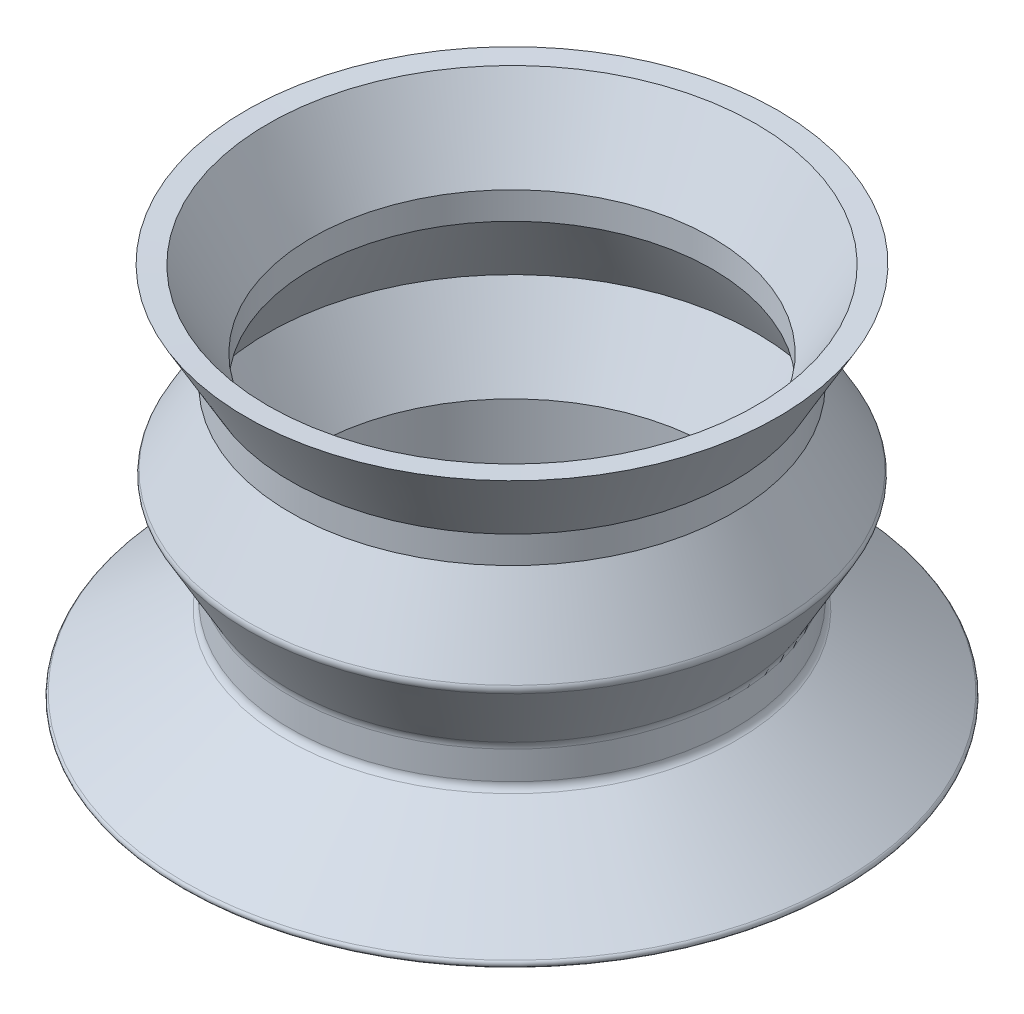
ISO-10303-21;
HEADER;
FILE_DESCRIPTION(('STEP AP214'),'2;1');
FILE_NAME('part.step','',(''),(''),'','','');
FILE_SCHEMA(('AUTOMOTIVE_DESIGN { 1 0 10303 214 1 1 1 1 }'));
ENDSEC;
DATA;
#1=APPLICATION_CONTEXT('core data for automotive mechanical design processes');
#2=APPLICATION_PROTOCOL_DEFINITION('international standard','automotive_design',2000,#1);
#3=PRODUCT_CONTEXT('',#1,'mechanical');
#4=PRODUCT('Part','Part','',(#3));
#5=PRODUCT_RELATED_PRODUCT_CATEGORY('part','',(#4));
#6=PRODUCT_DEFINITION_FORMATION('','',#4);
#7=PRODUCT_DEFINITION_CONTEXT('part definition',#1,'design');
#8=PRODUCT_DEFINITION('design','',#6,#7);
#9=PRODUCT_DEFINITION_SHAPE('','',#8);
#10=(LENGTH_UNIT() NAMED_UNIT(*) SI_UNIT(.MILLI.,.METRE.));
#11=(NAMED_UNIT(*) PLANE_ANGLE_UNIT() SI_UNIT($,.RADIAN.));
#12=(NAMED_UNIT(*) SI_UNIT($,.STERADIAN.) SOLID_ANGLE_UNIT());
#13=UNCERTAINTY_MEASURE_WITH_UNIT(LENGTH_MEASURE(1.E-05),#10,'distance_accuracy_value','');
#14=(GEOMETRIC_REPRESENTATION_CONTEXT(3) GLOBAL_UNCERTAINTY_ASSIGNED_CONTEXT((#13)) GLOBAL_UNIT_ASSIGNED_CONTEXT((#10,
#11,#12)) REPRESENTATION_CONTEXT('',''));
#15=CARTESIAN_POINT('',(0.,0.,0.));
#16=DIRECTION('',(0.,0.,1.));
#17=DIRECTION('',(1.,0.,0.));
#18=AXIS2_PLACEMENT_3D('',#15,#16,#17);
#19=CARTESIAN_POINT('',(0.,0.,0.));
#20=DIRECTION('',(0.,1.,0.));
#21=DIRECTION('',(0.,0.,1.));
#22=AXIS2_PLACEMENT_3D('',#19,#20,#21);
#23=CONICAL_SURFACE('',#22,18.,0.960070362405688);
#24=CARTESIAN_POINT('',(0.,-0.163846384103808,0.));
#25=DIRECTION('',(0.,-1.,0.));
#26=DIRECTION('',(0.,0.,-1.));
#27=AXIS2_PLACEMENT_3D('',#24,#25,#26);
#28=CIRCLE('',#27,17.7659337369946);
#29=CARTESIAN_POINT('',(0.,-0.163846384103808,-17.7659337369946));
#30=VERTEX_POINT('',#29);
#31=EDGE_CURVE('E79',#30,#30,#28,.T.);
#32=ORIENTED_EDGE('',*,*,#31,.T.);
#33=EDGE_LOOP('',(#32));
#34=FACE_BOUND('',#33,.T.);
#35=CARTESIAN_POINT('',(0.,-4.37185034822415,0.));
#36=DIRECTION('',(0.,-1.,0.));
#37=DIRECTION('',(0.,0.,-1.));
#38=AXIS2_PLACEMENT_3D('',#35,#36,#37);
#39=CIRCLE('',#38,11.7544995025369);
#40=CARTESIAN_POINT('',(0.,-4.37185034822415,-11.7544995025369));
#41=VERTEX_POINT('',#40);
#42=EDGE_CURVE('E83',#41,#41,#39,.T.);
#43=ORIENTED_EDGE('',*,*,#42,.F.);
#44=EDGE_LOOP('',(#43));
#45=FACE_BOUND('',#44,.T.);
#46=ADVANCED_FACE('F43',(#34,#45),#23,.T.);
#47=CARTESIAN_POINT('',(0.,-4.37185034822415,0.));
#48=DIRECTION('',(0.,-1.,0.));
#49=DIRECTION('',(0.,0.,-1.));
#50=AXIS2_PLACEMENT_3D('',#47,#48,#49);
#51=CONICAL_SURFACE('',#50,11.7544995025369,0.305362982194607);
#52=CARTESIAN_POINT('',(0.,-3.37185034822415,0.));
#53=DIRECTION('',(0.,-1.,0.));
#54=DIRECTION('',(0.,0.,-1.));
#55=AXIS2_PLACEMENT_3D('',#52,#53,#54);
#56=CIRCLE('',#55,11.4392772717178);
#57=CARTESIAN_POINT('',(0.,-3.37185034822415,-11.4392772717178));
#58=VERTEX_POINT('',#57);
#59=EDGE_CURVE('E87',#58,#58,#56,.T.);
#60=ORIENTED_EDGE('',*,*,#59,.F.);
#61=EDGE_LOOP('',(#60));
#62=FACE_BOUND('',#61,.T.);
#63=ORIENTED_EDGE('',*,*,#42,.T.);
#64=EDGE_LOOP('',(#63));
#65=FACE_BOUND('',#64,.T.);
#66=ADVANCED_FACE('F201',(#62,#65),#51,.F.);
#67=CARTESIAN_POINT('',(0.,-3.37185034822415,0.));
#68=DIRECTION('',(0.,1.,0.));
#69=DIRECTION('',(0.,0.,1.));
#70=AXIS2_PLACEMENT_3D('',#67,#68,#69);
#71=CONICAL_SURFACE('',#70,11.4392772717178,0.960070362405688);
#72=CARTESIAN_POINT('',(0.,0.,0.));
#73=DIRECTION('',(0.,-1.,0.));
#74=DIRECTION('',(0.,0.,-1.));
#75=AXIS2_PLACEMENT_3D('',#72,#73,#74);
#76=CIRCLE('',#75,16.2562063406095);
#77=CARTESIAN_POINT('',(0.,0.,-16.2562063406095));
#78=VERTEX_POINT('',#77);
#79=EDGE_CURVE('E91',#78,#78,#76,.T.);
#80=ORIENTED_EDGE('',*,*,#79,.F.);
#81=EDGE_LOOP('',(#80));
#82=FACE_BOUND('',#81,.T.);
#83=ORIENTED_EDGE('',*,*,#59,.T.);
#84=EDGE_LOOP('',(#83));
#85=FACE_BOUND('',#84,.T.);
#86=ADVANCED_FACE('F195',(#82,#85),#71,.F.);
#87=CARTESIAN_POINT('',(0.,0.,0.));
#88=DIRECTION('',(0.,-1.,0.));
#89=DIRECTION('',(0.,0.,-1.));
#90=AXIS2_PLACEMENT_3D('',#87,#88,#89);
#91=CONICAL_SURFACE('',#90,16.2562063406095,0.960070362405687);
#92=CARTESIAN_POINT('',(0.,3.2,0.));
#93=DIRECTION('',(0.,-1.,0.));
#94=DIRECTION('',(0.,0.,-1.));
#95=AXIS2_PLACEMENT_3D('',#92,#93,#94);
#96=CIRCLE('',#95,11.6847777691809);
#97=CARTESIAN_POINT('',(0.,3.2,-11.6847777691809));
#98=VERTEX_POINT('',#97);
#99=EDGE_CURVE('E95',#98,#98,#96,.T.);
#100=ORIENTED_EDGE('',*,*,#99,.F.);
#101=EDGE_LOOP('',(#100));
#102=FACE_BOUND('',#101,.T.);
#103=ORIENTED_EDGE('',*,*,#79,.T.);
#104=EDGE_LOOP('',(#103));
#105=FACE_BOUND('',#104,.T.);
#106=ADVANCED_FACE('F189',(#102,#105),#91,.F.);
#107=CARTESIAN_POINT('',(-10.8754508224679,3.2,0.));
#108=DIRECTION('',(0.,1.,0.));
#109=DIRECTION('',(0.,0.,1.));
#110=AXIS2_PLACEMENT_3D('',#107,#108,#109);
#111=PLANE('',#110);
#112=CARTESIAN_POINT('',(0.,3.2,0.));
#113=DIRECTION('',(0.,-1.,0.));
#114=DIRECTION('',(0.,0.,-1.));
#115=AXIS2_PLACEMENT_3D('',#112,#113,#114);
#116=CIRCLE('',#115,10.8754508224679);
#117=CARTESIAN_POINT('',(0.,3.2,-10.8754508224679));
#118=VERTEX_POINT('',#117);
#119=EDGE_CURVE('E99',#118,#118,#116,.T.);
#120=ORIENTED_EDGE('',*,*,#119,.F.);
#121=EDGE_LOOP('',(#120));
#122=FACE_BOUND('',#121,.T.);
#123=ORIENTED_EDGE('',*,*,#99,.T.);
#124=EDGE_LOOP('',(#123));
#125=FACE_BOUND('',#124,.T.);
#126=ADVANCED_FACE('F183',(#122,#125),#111,.F.);
#127=CARTESIAN_POINT('',(0.,-8.65000000000001,0.));
#128=DIRECTION('',(0.,-1.,0.));
#129=DIRECTION('',(0.,0.,-1.));
#130=AXIS2_PLACEMENT_3D('',#127,#128,#129);
#131=CYLINDRICAL_SURFACE('',#130,10.8754508224679);
#132=CARTESIAN_POINT('',(0.,6.24760337639346,0.));
#133=DIRECTION('',(0.,-1.,0.));
#134=DIRECTION('',(0.,0.,-1.));
#135=AXIS2_PLACEMENT_3D('',#132,#133,#134);
#136=CIRCLE('',#135,10.8754508224679);
#137=CARTESIAN_POINT('',(0.,6.24760337639346,-10.8754508224679));
#138=VERTEX_POINT('',#137);
#139=EDGE_CURVE('E103',#138,#138,#136,.T.);
#140=ORIENTED_EDGE('',*,*,#139,.F.);
#141=EDGE_LOOP('',(#140));
#142=FACE_BOUND('',#141,.T.);
#143=ORIENTED_EDGE('',*,*,#119,.T.);
#144=EDGE_LOOP('',(#143));
#145=FACE_BOUND('',#144,.T.);
#146=ADVANCED_FACE('F177',(#142,#145),#131,.F.);
#147=CARTESIAN_POINT('',(0.,6.24760337639346,0.));
#148=DIRECTION('',(0.,1.,0.));
#149=DIRECTION('',(0.,0.,1.));
#150=AXIS2_PLACEMENT_3D('',#147,#148,#149);
#151=CONICAL_SURFACE('',#150,10.8754508224679,0.519146114246528);
#152=CARTESIAN_POINT('',(0.,10.4,0.));
#153=DIRECTION('',(0.,-1.,0.));
#154=DIRECTION('',(0.,0.,-1.));
#155=AXIS2_PLACEMENT_3D('',#152,#153,#154);
#156=CIRCLE('',#155,13.2482488931002);
#157=CARTESIAN_POINT('',(0.,10.4,-13.2482488931002));
#158=VERTEX_POINT('',#157);
#159=EDGE_CURVE('E107',#158,#158,#156,.T.);
#160=ORIENTED_EDGE('',*,*,#159,.F.);
#161=EDGE_LOOP('',(#160));
#162=FACE_BOUND('',#161,.T.);
#163=ORIENTED_EDGE('',*,*,#139,.T.);
#164=EDGE_LOOP('',(#163));
#165=FACE_BOUND('',#164,.T.);
#166=ADVANCED_FACE('F171',(#162,#165),#151,.F.);
#167=CARTESIAN_POINT('',(0.,10.4,0.));
#168=DIRECTION('',(0.,-1.,0.));
#169=DIRECTION('',(0.,0.,-1.));
#170=AXIS2_PLACEMENT_3D('',#167,#168,#169);
#171=CONICAL_SURFACE('',#170,13.2482488931002,0.519146114246523);
#172=CARTESIAN_POINT('',(0.,14.6,0.));
#173=DIRECTION('',(0.,-1.,0.));
#174=DIRECTION('',(0.,0.,-1.));
#175=AXIS2_PLACEMENT_3D('',#172,#173,#174);
#176=CIRCLE('',#175,10.8482488931002);
#177=CARTESIAN_POINT('',(0.,14.6,-10.8482488931002));
#178=VERTEX_POINT('',#177);
#179=EDGE_CURVE('E111',#178,#178,#176,.T.);
#180=ORIENTED_EDGE('',*,*,#179,.F.);
#181=EDGE_LOOP('',(#180));
#182=FACE_BOUND('',#181,.T.);
#183=ORIENTED_EDGE('',*,*,#159,.T.);
#184=EDGE_LOOP('',(#183));
#185=FACE_BOUND('',#184,.T.);
#186=ADVANCED_FACE('F165',(#182,#185),#171,.F.);
#187=CARTESIAN_POINT('',(0.,-8.65000000000001,0.));
#188=DIRECTION('',(0.,-1.,0.));
#189=DIRECTION('',(0.,0.,-1.));
#190=AXIS2_PLACEMENT_3D('',#187,#188,#189);
#191=CYLINDRICAL_SURFACE('',#190,10.8482488931002);
#192=CARTESIAN_POINT('',(0.,16.0759466797629,0.));
#193=DIRECTION('',(0.,-1.,0.));
#194=DIRECTION('',(0.,0.,-1.));
#195=AXIS2_PLACEMENT_3D('',#192,#193,#194);
#196=CIRCLE('',#195,10.8482488931002);
#197=CARTESIAN_POINT('',(0.,16.0759466797629,-10.8482488931002));
#198=VERTEX_POINT('',#197);
#199=EDGE_CURVE('E115',#198,#198,#196,.T.);
#200=ORIENTED_EDGE('',*,*,#199,.F.);
#201=EDGE_LOOP('',(#200));
#202=FACE_BOUND('',#201,.T.);
#203=ORIENTED_EDGE('',*,*,#179,.T.);
#204=EDGE_LOOP('',(#203));
#205=FACE_BOUND('',#204,.T.);
#206=ADVANCED_FACE('F159',(#202,#205),#191,.F.);
#207=CARTESIAN_POINT('',(0.,16.0759466797629,0.));
#208=DIRECTION('',(0.,1.,0.));
#209=DIRECTION('',(0.,0.,1.));
#210=AXIS2_PLACEMENT_3D('',#207,#208,#209);
#211=CONICAL_SURFACE('',#210,10.8482488931002,0.519146114246528);
#212=CARTESIAN_POINT('',(0.,20.2283433033694,0.));
#213=DIRECTION('',(0.,-1.,0.));
#214=DIRECTION('',(0.,0.,-1.));
#215=AXIS2_PLACEMENT_3D('',#212,#213,#214);
#216=CIRCLE('',#215,13.2210469637325);
#217=CARTESIAN_POINT('',(0.,20.2283433033694,-13.2210469637325));
#218=VERTEX_POINT('',#217);
#219=EDGE_CURVE('E119',#218,#218,#216,.T.);
#220=ORIENTED_EDGE('',*,*,#219,.F.);
#221=EDGE_LOOP('',(#220));
#222=FACE_BOUND('',#221,.T.);
#223=ORIENTED_EDGE('',*,*,#199,.T.);
#224=EDGE_LOOP('',(#223));
#225=FACE_BOUND('',#224,.T.);
#226=ADVANCED_FACE('F153',(#222,#225),#211,.F.);
#227=CARTESIAN_POINT('',(0.,20.2283433033694,0.));
#228=DIRECTION('',(0.,1.,0.));
#229=DIRECTION('',(0.,0.,1.));
#230=AXIS2_PLACEMENT_3D('',#227,#228,#229);
#231=CONICAL_SURFACE('',#230,13.2210469637325,1.53044057889535);
#232=CARTESIAN_POINT('',(0.,20.2759466797628,0.));
#233=DIRECTION('',(0.,-1.,0.));
#234=DIRECTION('',(0.,0.,-1.));
#235=AXIS2_PLACEMENT_3D('',#232,#233,#234);
#236=CIRCLE('',#235,14.4);
#237=CARTESIAN_POINT('',(0.,20.2759466797628,-14.4));
#238=VERTEX_POINT('',#237);
#239=EDGE_CURVE('E123',#238,#238,#236,.T.);
#240=ORIENTED_EDGE('',*,*,#239,.F.);
#241=EDGE_LOOP('',(#240));
#242=FACE_BOUND('',#241,.T.);
#243=ORIENTED_EDGE('',*,*,#219,.T.);
#244=EDGE_LOOP('',(#243));
#245=FACE_BOUND('',#244,.T.);
#246=ADVANCED_FACE('F147',(#242,#245),#231,.F.);
#247=CARTESIAN_POINT('',(0.,20.2759466797628,0.));
#248=DIRECTION('',(0.,1.,0.));
#249=DIRECTION('',(0.,0.,1.));
#250=AXIS2_PLACEMENT_3D('',#247,#248,#249);
#251=CONICAL_SURFACE('',#250,14.4,0.519146114246527);
#252=CARTESIAN_POINT('',(0.,16.0759466797629,0.));
#253=DIRECTION('',(0.,-1.,0.));
#254=DIRECTION('',(0.,0.,-1.));
#255=AXIS2_PLACEMENT_3D('',#252,#253,#254);
#256=CIRCLE('',#255,12.);
#257=CARTESIAN_POINT('',(0.,16.0759466797629,-12.));
#258=VERTEX_POINT('',#257);
#259=EDGE_CURVE('E127',#258,#258,#256,.T.);
#260=ORIENTED_EDGE('',*,*,#259,.F.);
#261=EDGE_LOOP('',(#260));
#262=FACE_BOUND('',#261,.T.);
#263=ORIENTED_EDGE('',*,*,#239,.T.);
#264=EDGE_LOOP('',(#263));
#265=FACE_BOUND('',#264,.T.);
#266=ADVANCED_FACE('F141',(#262,#265),#251,.T.);
#267=CARTESIAN_POINT('',(0.,-8.65000000000001,0.));
#268=DIRECTION('',(0.,-1.,0.));
#269=DIRECTION('',(0.,0.,-1.));
#270=AXIS2_PLACEMENT_3D('',#267,#268,#269);
#271=CYLINDRICAL_SURFACE('',#270,12.);
#272=CARTESIAN_POINT('',(0.,14.6,0.));
#273=DIRECTION('',(0.,-1.,0.));
#274=DIRECTION('',(0.,0.,-1.));
#275=AXIS2_PLACEMENT_3D('',#272,#273,#274);
#276=CIRCLE('',#275,12.);
#277=CARTESIAN_POINT('',(0.,14.6,-12.));
#278=VERTEX_POINT('',#277);
#279=EDGE_CURVE('E131',#278,#278,#276,.T.);
#280=ORIENTED_EDGE('',*,*,#279,.F.);
#281=EDGE_LOOP('',(#280));
#282=FACE_BOUND('',#281,.T.);
#283=ORIENTED_EDGE('',*,*,#259,.T.);
#284=EDGE_LOOP('',(#283));
#285=FACE_BOUND('',#284,.T.);
#286=ADVANCED_FACE('F138',(#282,#285),#271,.T.);
#287=CARTESIAN_POINT('',(0.,14.6,0.));
#288=DIRECTION('',(0.,-1.,0.));
#289=DIRECTION('',(0.,0.,-1.));
#290=AXIS2_PLACEMENT_3D('',#287,#288,#289);
#291=CONICAL_SURFACE('',#290,12.,0.519146114246523);
#292=CARTESIAN_POINT('',(0.,10.5984555753427,0.));
#293=DIRECTION('',(0.,1.,0.));
#294=DIRECTION('',(0.,0.,1.));
#295=AXIS2_PLACEMENT_3D('',#292,#293,#294);
#296=CIRCLE('',#295,14.2865968140899);
#297=CARTESIAN_POINT('',(0.,10.5984555753427,14.2865968140899));
#298=VERTEX_POINT('',#297);
#299=EDGE_CURVE('E56',#298,#298,#296,.T.);
#300=ORIENTED_EDGE('',*,*,#299,.T.);
#301=EDGE_LOOP('',(#300));
#302=FACE_BOUND('',#301,.T.);
#303=ORIENTED_EDGE('',*,*,#279,.T.);
#304=EDGE_LOOP('',(#303));
#305=FACE_BOUND('',#304,.T.);
#306=ADVANCED_FACE('F136',(#302,#305),#291,.T.);
#307=CARTESIAN_POINT('',(0.,10.4,0.));
#308=DIRECTION('',(0.,1.,0.));
#309=DIRECTION('',(0.,0.,1.));
#310=AXIS2_PLACEMENT_3D('',#307,#308,#309);
#311=CONICAL_SURFACE('',#310,14.4,0.519146114246527);
#312=CARTESIAN_POINT('',(0.,6.38445960102576,0.));
#313=DIRECTION('',(0.,1.,0.));
#314=DIRECTION('',(0.,0.,1.));
#315=AXIS2_PLACEMENT_3D('',#312,#313,#314);
#316=CIRCLE('',#315,12.1054054863004);
#317=CARTESIAN_POINT('',(0.,6.38445960102576,12.1054054863004));
#318=VERTEX_POINT('',#317);
#319=EDGE_CURVE('E10',#318,#318,#316,.T.);
#320=ORIENTED_EDGE('',*,*,#319,.T.);
#321=EDGE_LOOP('',(#320));
#322=FACE_BOUND('',#321,.T.);
#323=CARTESIAN_POINT('',(0.,10.2015444246572,0.));
#324=DIRECTION('',(0.,-1.,0.));
#325=DIRECTION('',(0.,0.,-1.));
#326=AXIS2_PLACEMENT_3D('',#323,#324,#325);
#327=CIRCLE('',#326,14.2865968140899);
#328=CARTESIAN_POINT('',(0.,10.2015444246572,-14.2865968140899));
#329=VERTEX_POINT('',#328);
#330=EDGE_CURVE('E61',#329,#329,#327,.T.);
#331=ORIENTED_EDGE('',*,*,#330,.T.);
#332=EDGE_LOOP('',(#331));
#333=FACE_BOUND('',#332,.T.);
#334=ADVANCED_FACE('F237',(#322,#333),#311,.T.);
#335=CARTESIAN_POINT('',(0.,-8.65000000000001,0.));
#336=DIRECTION('',(0.,-1.,0.));
#337=DIRECTION('',(0.,0.,-1.));
#338=AXIS2_PLACEMENT_3D('',#335,#336,#337);
#339=CYLINDRICAL_SURFACE('',#338,12.);
#340=CARTESIAN_POINT('',(0.,5.98754845034029,0.));
#341=DIRECTION('',(0.,-1.,0.));
#342=DIRECTION('',(0.,0.,-1.));
#343=AXIS2_PLACEMENT_3D('',#340,#341,#342);
#344=CIRCLE('',#343,12.);
#345=CARTESIAN_POINT('',(0.,5.98754845034029,-12.));
#346=VERTEX_POINT('',#345);
#347=EDGE_CURVE('E51',#346,#346,#344,.T.);
#348=ORIENTED_EDGE('',*,*,#347,.T.);
#349=EDGE_LOOP('',(#348));
#350=FACE_BOUND('',#349,.T.);
#351=CARTESIAN_POINT('',(0.,4.46032778078669,0.));
#352=DIRECTION('',(0.,-1.,0.));
#353=DIRECTION('',(0.,0.,-1.));
#354=AXIS2_PLACEMENT_3D('',#351,#352,#353);
#355=CIRCLE('',#354,12.);
#356=CARTESIAN_POINT('',(0.,4.46032778078669,-12.));
#357=VERTEX_POINT('',#356);
#358=EDGE_CURVE('E67',#357,#357,#355,.F.);
#359=ORIENTED_EDGE('',*,*,#358,.T.);
#360=EDGE_LOOP('',(#359));
#361=FACE_BOUND('',#360,.T.);
#362=ADVANCED_FACE('F238',(#350,#361),#339,.T.);
#363=CARTESIAN_POINT('',(0.,4.2,0.));
#364=DIRECTION('',(0.,-1.,0.));
#365=DIRECTION('',(0.,0.,-1.));
#366=AXIS2_PLACEMENT_3D('',#363,#364,#365);
#367=CONICAL_SURFACE('',#366,12.,0.960070362405688);
#368=CARTESIAN_POINT('',(0.,4.05071182052717,0.));
#369=DIRECTION('',(0.,-1.,0.));
#370=DIRECTION('',(0.,0.,-1.));
#371=AXIS2_PLACEMENT_3D('',#368,#369,#370);
#372=CIRCLE('',#371,12.2132688278183);
#373=CARTESIAN_POINT('',(0.,4.05071182052717,-12.2132688278183));
#374=VERTEX_POINT('',#373);
#375=EDGE_CURVE('E71',#374,#374,#372,.T.);
#376=ORIENTED_EDGE('',*,*,#375,.T.);
#377=EDGE_LOOP('',(#376));
#378=FACE_BOUND('',#377,.T.);
#379=CARTESIAN_POINT('',(0.,0.163846384103807,0.));
#380=DIRECTION('',(0.,1.,0.));
#381=DIRECTION('',(0.,0.,1.));
#382=AXIS2_PLACEMENT_3D('',#379,#380,#381);
#383=CIRCLE('',#382,17.7659337369946);
#384=CARTESIAN_POINT('',(0.,0.163846384103807,17.7659337369946));
#385=VERTEX_POINT('',#384);
#386=EDGE_CURVE('E75',#385,#385,#383,.T.);
#387=ORIENTED_EDGE('',*,*,#386,.T.);
#388=EDGE_LOOP('',(#387));
#389=FACE_BOUND('',#388,.T.);
#390=ADVANCED_FACE('F220',(#378,#389),#367,.T.);
#391=CARTESIAN_POINT('',(0.,0.,0.));
#392=DIRECTION('',(0.,1.,0.));
#393=DIRECTION('',(0.,0.,1.));
#394=AXIS2_PLACEMENT_3D('',#391,#392,#393);
#395=TOROIDAL_SURFACE('',#394,17.6512412681219,0.2);
#396=ORIENTED_EDGE('',*,*,#386,.F.);
#397=EDGE_LOOP('',(#396));
#398=FACE_BOUND('',#397,.T.);
#399=ORIENTED_EDGE('',*,*,#31,.F.);
#400=EDGE_LOOP('',(#399));
#401=FACE_BOUND('',#400,.T.);
#402=ADVANCED_FACE('F217',(#398,#401),#395,.T.);
#403=CARTESIAN_POINT('',(0.,4.46032778078669,0.));
#404=DIRECTION('',(0.,-1.,0.));
#405=DIRECTION('',(0.,0.,-1.));
#406=AXIS2_PLACEMENT_3D('',#403,#404,#405);
#407=TOROIDAL_SURFACE('',#406,12.5,0.5);
#408=ORIENTED_EDGE('',*,*,#358,.F.);
#409=EDGE_LOOP('',(#408));
#410=FACE_BOUND('',#409,.T.);
#411=ORIENTED_EDGE('',*,*,#375,.F.);
#412=EDGE_LOOP('',(#411));
#413=FACE_BOUND('',#412,.T.);
#414=ADVANCED_FACE('F219',(#410,#413),#407,.F.);
#415=CARTESIAN_POINT('',(0.,10.4,0.));
#416=DIRECTION('',(0.,1.,0.));
#417=DIRECTION('',(0.,0.,1.));
#418=AXIS2_PLACEMENT_3D('',#415,#416,#417);
#419=TOROIDAL_SURFACE('',#418,13.9392995572401,0.4);
#420=ORIENTED_EDGE('',*,*,#299,.F.);
#421=EDGE_LOOP('',(#420));
#422=FACE_BOUND('',#421,.T.);
#423=ORIENTED_EDGE('',*,*,#330,.F.);
#424=EDGE_LOOP('',(#423));
#425=FACE_BOUND('',#424,.T.);
#426=ADVANCED_FACE('F223',(#422,#425),#419,.T.);
#427=CARTESIAN_POINT('',(0.,5.98754845034029,0.));
#428=DIRECTION('',(0.,-1.,0.));
#429=DIRECTION('',(0.,0.,-1.));
#430=AXIS2_PLACEMENT_3D('',#427,#428,#429);
#431=TOROIDAL_SURFACE('',#430,12.8,0.8);
#432=ORIENTED_EDGE('',*,*,#319,.F.);
#433=EDGE_LOOP('',(#432));
#434=FACE_BOUND('',#433,.T.);
#435=ORIENTED_EDGE('',*,*,#347,.F.);
#436=EDGE_LOOP('',(#435));
#437=FACE_BOUND('',#436,.T.);
#438=ADVANCED_FACE('F45',(#434,#437),#431,.F.);
#439=CLOSED_SHELL('',(#46,#66,#86,#106,#126,#146,#166,#186,#206,#226,#246,#266,#286,#306,#334,
#362,#390,#402,#414,#426,#438));
#440=MANIFOLD_SOLID_BREP('B2',#439);
#441=ADVANCED_BREP_SHAPE_REPRESENTATION('',(#18,#440),#14);
#442=SHAPE_DEFINITION_REPRESENTATION(#9,#441);
ENDSEC;
END-ISO-10303-21;
